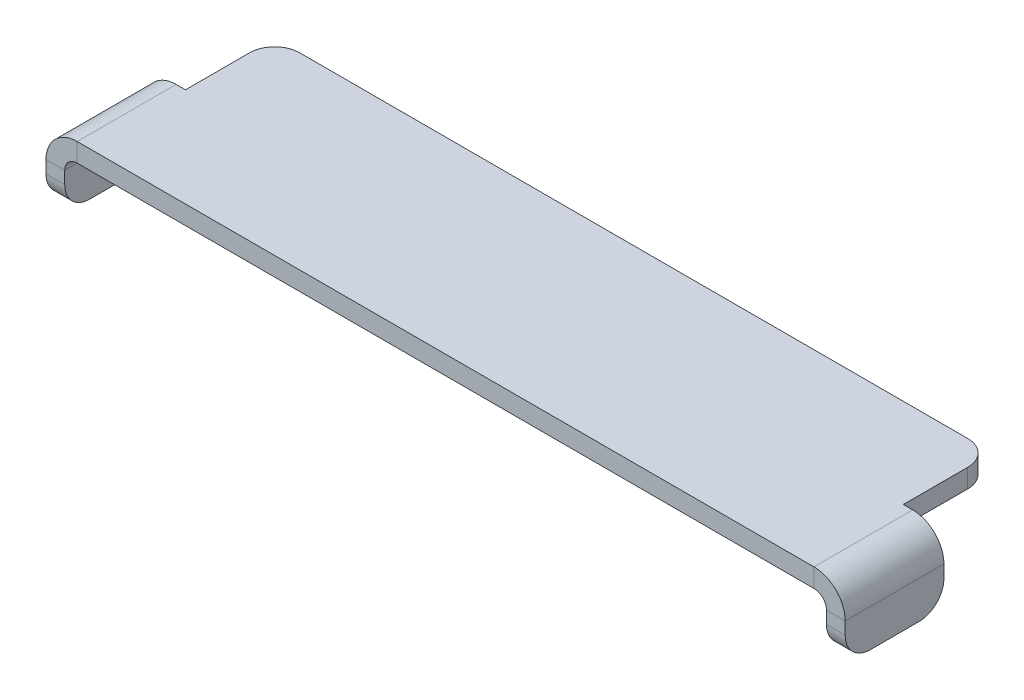
ISO-10303-21;
HEADER;
FILE_DESCRIPTION(('STEP AP214'),'2;1');
FILE_NAME('part.step','',(''),(''),'','','');
FILE_SCHEMA(('AUTOMOTIVE_DESIGN { 1 0 10303 214 1 1 1 1 }'));
ENDSEC;
DATA;
#1=APPLICATION_CONTEXT('core data for automotive mechanical design processes');
#2=APPLICATION_PROTOCOL_DEFINITION('international standard','automotive_design',2000,#1);
#3=PRODUCT_CONTEXT('',#1,'mechanical');
#4=PRODUCT('Part','Part','',(#3));
#5=PRODUCT_RELATED_PRODUCT_CATEGORY('part','',(#4));
#6=PRODUCT_DEFINITION_FORMATION('','',#4);
#7=PRODUCT_DEFINITION_CONTEXT('part definition',#1,'design');
#8=PRODUCT_DEFINITION('design','',#6,#7);
#9=PRODUCT_DEFINITION_SHAPE('','',#8);
#10=(LENGTH_UNIT() NAMED_UNIT(*) SI_UNIT(.MILLI.,.METRE.));
#11=(NAMED_UNIT(*) PLANE_ANGLE_UNIT() SI_UNIT($,.RADIAN.));
#12=(NAMED_UNIT(*) SI_UNIT($,.STERADIAN.) SOLID_ANGLE_UNIT());
#13=UNCERTAINTY_MEASURE_WITH_UNIT(LENGTH_MEASURE(1.E-05),#10,'distance_accuracy_value','');
#14=(GEOMETRIC_REPRESENTATION_CONTEXT(3) GLOBAL_UNCERTAINTY_ASSIGNED_CONTEXT((#13)) GLOBAL_UNIT_ASSIGNED_CONTEXT((#10,
#11,#12)) REPRESENTATION_CONTEXT('',''));
#15=CARTESIAN_POINT('',(0.,0.,0.));
#16=DIRECTION('',(0.,0.,1.));
#17=DIRECTION('',(1.,0.,0.));
#18=AXIS2_PLACEMENT_3D('',#15,#16,#17);
#19=CARTESIAN_POINT('',(0.,-1.5,0.));
#20=DIRECTION('',(0.,-1.,0.));
#21=DIRECTION('',(0.,0.,-1.));
#22=AXIS2_PLACEMENT_3D('',#19,#20,#21);
#23=PLANE('',#22);
#24=DIRECTION('',(0.,0.,1.));
#25=VECTOR('',#24,1.);
#26=CARTESIAN_POINT('',(3.25,-1.5,-8.67099203048986));
#27=LINE('',#26,#25);
#28=CARTESIAN_POINT('',(3.25,-1.5,-13.0604680029471));
#29=VERTEX_POINT('',#28);
#30=CARTESIAN_POINT('',(3.25,-1.5,-7.92099203048986));
#31=VERTEX_POINT('',#30);
#32=EDGE_CURVE('E340',#29,#31,#27,.T.);
#33=ORIENTED_EDGE('',*,*,#32,.F.);
#34=CARTESIAN_POINT('',(5.25,-1.5,-13.0604680029471));
#35=DIRECTION('',(0.,-1.,0.));
#36=DIRECTION('',(0.,0.,-1.));
#37=AXIS2_PLACEMENT_3D('',#34,#35,#36);
#38=CIRCLE('',#37,2.);
#39=CARTESIAN_POINT('',(5.25,-1.5,-15.0604680029471));
#40=VERTEX_POINT('',#39);
#41=EDGE_CURVE('E406',#29,#40,#38,.T.);
#42=ORIENTED_EDGE('',*,*,#41,.T.);
#43=DIRECTION('',(-1.,0.,0.));
#44=VECTOR('',#43,1.);
#45=CARTESIAN_POINT('',(0.,-1.5,-15.0604680029471));
#46=LINE('',#45,#44);
#47=CARTESIAN_POINT('',(58.75,-1.5,-15.0604680029471));
#48=VERTEX_POINT('',#47);
#49=EDGE_CURVE('E358',#48,#40,#46,.T.);
#50=ORIENTED_EDGE('',*,*,#49,.F.);
#51=CARTESIAN_POINT('',(58.75,-1.5,-13.0604680029471));
#52=DIRECTION('',(0.,-1.,0.));
#53=DIRECTION('',(0.,0.,-1.));
#54=AXIS2_PLACEMENT_3D('',#51,#52,#53);
#55=CIRCLE('',#54,2.);
#56=CARTESIAN_POINT('',(60.75,-1.5,-13.0604680029471));
#57=VERTEX_POINT('',#56);
#58=EDGE_CURVE('E404',#48,#57,#55,.T.);
#59=ORIENTED_EDGE('',*,*,#58,.T.);
#60=DIRECTION('',(0.,0.,-1.));
#61=VECTOR('',#60,1.);
#62=CARTESIAN_POINT('',(60.75,-1.5,-7.9044110420261));
#63=LINE('',#62,#61);
#64=CARTESIAN_POINT('',(60.75,-1.5,-7.9044110420261));
#65=VERTEX_POINT('',#64);
#66=EDGE_CURVE('E351',#65,#57,#63,.T.);
#67=ORIENTED_EDGE('',*,*,#66,.F.);
#68=DIRECTION('',(-1.,0.,0.));
#69=VECTOR('',#68,1.);
#70=CARTESIAN_POINT('',(61.5,-1.5,-7.9044110420261));
#71=LINE('',#70,#69);
#72=CARTESIAN_POINT('',(61.5,-1.5,-7.9044110420261));
#73=VERTEX_POINT('',#72);
#74=EDGE_CURVE('E347',#73,#65,#71,.T.);
#75=ORIENTED_EDGE('',*,*,#74,.F.);
#76=DIRECTION('',(0.,0.,1.));
#77=VECTOR('',#76,1.);
#78=CARTESIAN_POINT('',(61.5,-1.5,0.));
#79=LINE('',#78,#77);
#80=CARTESIAN_POINT('',(61.5,-1.5,0.));
#81=VERTEX_POINT('',#80);
#82=EDGE_CURVE('E330',#81,#73,#79,.F.);
#83=ORIENTED_EDGE('',*,*,#82,.F.);
#84=DIRECTION('',(1.,0.,0.));
#85=VECTOR('',#84,1.);
#86=CARTESIAN_POINT('',(0.,-1.5,0.));
#87=LINE('',#86,#85);
#88=CARTESIAN_POINT('',(2.5,-1.5,0.));
#89=VERTEX_POINT('',#88);
#90=EDGE_CURVE('E356',#89,#81,#87,.T.);
#91=ORIENTED_EDGE('',*,*,#90,.F.);
#92=DIRECTION('',(0.,0.,-1.));
#93=VECTOR('',#92,1.);
#94=CARTESIAN_POINT('',(2.5,-1.5,-7.92099203048986));
#95=LINE('',#94,#93);
#96=CARTESIAN_POINT('',(2.5,-1.5,-7.92099203048986));
#97=VERTEX_POINT('',#96);
#98=EDGE_CURVE('E285',#97,#89,#95,.F.);
#99=ORIENTED_EDGE('',*,*,#98,.F.);
#100=DIRECTION('',(-1.,0.,0.));
#101=VECTOR('',#100,1.);
#102=CARTESIAN_POINT('',(3.25,-1.5,-7.92099203048986));
#103=LINE('',#102,#101);
#104=EDGE_CURVE('E343',#31,#97,#103,.T.);
#105=ORIENTED_EDGE('',*,*,#104,.F.);
#106=EDGE_LOOP('',(#33,#42,#50,#59,#67,#75,#83,#91,#99,#105));
#107=FACE_BOUND('',#106,.T.);
#108=ADVANCED_FACE('F75',(#107),#23,.T.);
#109=CARTESIAN_POINT('',(0.,0.,0.));
#110=DIRECTION('',(0.,-1.,0.));
#111=DIRECTION('',(0.,0.,-1.));
#112=AXIS2_PLACEMENT_3D('',#109,#110,#111);
#113=PLANE('',#112);
#114=DIRECTION('',(-1.,0.,0.));
#115=VECTOR('',#114,1.);
#116=CARTESIAN_POINT('',(0.,0.,-15.0604680029471));
#117=LINE('',#116,#115);
#118=CARTESIAN_POINT('',(58.75,0.,-15.0604680029471));
#119=VERTEX_POINT('',#118);
#120=CARTESIAN_POINT('',(5.25,0.,-15.0604680029471));
#121=VERTEX_POINT('',#120);
#122=EDGE_CURVE('E359',#119,#121,#117,.T.);
#123=ORIENTED_EDGE('',*,*,#122,.T.);
#124=CARTESIAN_POINT('',(5.25,0.,-13.0604680029471));
#125=DIRECTION('',(0.,-1.,0.));
#126=DIRECTION('',(0.,0.,-1.));
#127=AXIS2_PLACEMENT_3D('',#124,#125,#126);
#128=CIRCLE('',#127,2.);
#129=CARTESIAN_POINT('',(3.25,0.,-13.0604680029471));
#130=VERTEX_POINT('',#129);
#131=EDGE_CURVE('E400',#121,#130,#128,.F.);
#132=ORIENTED_EDGE('',*,*,#131,.T.);
#133=DIRECTION('',(0.,0.,-1.));
#134=VECTOR('',#133,1.);
#135=CARTESIAN_POINT('',(3.25,0.,0.));
#136=LINE('',#135,#134);
#137=CARTESIAN_POINT('',(3.25,0.,-7.92099203048986));
#138=VERTEX_POINT('',#137);
#139=EDGE_CURVE('E373',#138,#130,#136,.T.);
#140=ORIENTED_EDGE('',*,*,#139,.F.);
#141=DIRECTION('',(1.,0.,0.));
#142=VECTOR('',#141,1.);
#143=CARTESIAN_POINT('',(0.,0.,-7.92099203048986));
#144=LINE('',#143,#142);
#145=CARTESIAN_POINT('',(2.5,0.,-7.92099203048986));
#146=VERTEX_POINT('',#145);
#147=EDGE_CURVE('E371',#146,#138,#144,.T.);
#148=ORIENTED_EDGE('',*,*,#147,.F.);
#149=DIRECTION('',(0.,0.,-1.));
#150=VECTOR('',#149,1.);
#151=CARTESIAN_POINT('',(2.5,0.,-7.92099203048986));
#152=LINE('',#151,#150);
#153=CARTESIAN_POINT('',(2.5,0.,0.));
#154=VERTEX_POINT('',#153);
#155=EDGE_CURVE('E234',#146,#154,#152,.F.);
#156=ORIENTED_EDGE('',*,*,#155,.T.);
#157=DIRECTION('',(1.,0.,0.));
#158=VECTOR('',#157,1.);
#159=CARTESIAN_POINT('',(0.,0.,0.));
#160=LINE('',#159,#158);
#161=CARTESIAN_POINT('',(61.5,0.,0.));
#162=VERTEX_POINT('',#161);
#163=EDGE_CURVE('E350',#154,#162,#160,.T.);
#164=ORIENTED_EDGE('',*,*,#163,.T.);
#165=DIRECTION('',(0.,0.,1.));
#166=VECTOR('',#165,1.);
#167=CARTESIAN_POINT('',(61.5,0.,0.));
#168=LINE('',#167,#166);
#169=CARTESIAN_POINT('',(61.5,0.,-7.9044110420261));
#170=VERTEX_POINT('',#169);
#171=EDGE_CURVE('E318',#162,#170,#168,.F.);
#172=ORIENTED_EDGE('',*,*,#171,.T.);
#173=DIRECTION('',(1.,0.,0.));
#174=VECTOR('',#173,1.);
#175=CARTESIAN_POINT('',(0.,0.,-7.9044110420261));
#176=LINE('',#175,#174);
#177=CARTESIAN_POINT('',(60.75,0.,-7.9044110420261));
#178=VERTEX_POINT('',#177);
#179=EDGE_CURVE('E368',#178,#170,#176,.T.);
#180=ORIENTED_EDGE('',*,*,#179,.F.);
#181=DIRECTION('',(0.,0.,1.));
#182=VECTOR('',#181,1.);
#183=CARTESIAN_POINT('',(60.75,0.,0.));
#184=LINE('',#183,#182);
#185=CARTESIAN_POINT('',(60.75,0.,-13.0604680029471));
#186=VERTEX_POINT('',#185);
#187=EDGE_CURVE('E362',#186,#178,#184,.T.);
#188=ORIENTED_EDGE('',*,*,#187,.F.);
#189=CARTESIAN_POINT('',(58.75,0.,-13.0604680029471));
#190=DIRECTION('',(0.,-1.,0.));
#191=DIRECTION('',(0.,0.,-1.));
#192=AXIS2_PLACEMENT_3D('',#189,#190,#191);
#193=CIRCLE('',#192,2.);
#194=EDGE_CURVE('E398',#186,#119,#193,.F.);
#195=ORIENTED_EDGE('',*,*,#194,.T.);
#196=EDGE_LOOP('',(#123,#132,#140,#148,#156,#164,#172,#180,#188,#195));
#197=FACE_BOUND('',#196,.T.);
#198=ADVANCED_FACE('F472',(#197),#113,.F.);
#199=CARTESIAN_POINT('',(0.,-1.5,0.));
#200=DIRECTION('',(0.,0.,1.));
#201=DIRECTION('',(1.,0.,0.));
#202=AXIS2_PLACEMENT_3D('',#199,#200,#201);
#203=PLANE('',#202);
#204=DIRECTION('',(0.,1.,0.));
#205=VECTOR('',#204,1.);
#206=CARTESIAN_POINT('',(2.5,-1.5,0.));
#207=LINE('',#206,#205);
#208=EDGE_CURVE('E289',#89,#154,#207,.T.);
#209=ORIENTED_EDGE('',*,*,#208,.F.);
#210=ORIENTED_EDGE('',*,*,#90,.T.);
#211=DIRECTION('',(0.,1.,0.));
#212=VECTOR('',#211,1.);
#213=CARTESIAN_POINT('',(61.5,-1.5,0.));
#214=LINE('',#213,#212);
#215=EDGE_CURVE('E324',#81,#162,#214,.T.);
#216=ORIENTED_EDGE('',*,*,#215,.T.);
#217=ORIENTED_EDGE('',*,*,#163,.F.);
#218=EDGE_LOOP('',(#209,#210,#216,#217));
#219=FACE_BOUND('',#218,.T.);
#220=ADVANCED_FACE('F470',(#219),#203,.T.);
#221=CARTESIAN_POINT('',(0.,-1.5,-15.0604680029471));
#222=DIRECTION('',(0.,0.,-1.));
#223=DIRECTION('',(-1.,0.,0.));
#224=AXIS2_PLACEMENT_3D('',#221,#222,#223);
#225=PLANE('',#224);
#226=ORIENTED_EDGE('',*,*,#49,.T.);
#227=DIRECTION('',(0.,1.,0.));
#228=VECTOR('',#227,1.);
#229=CARTESIAN_POINT('',(5.25,-1.5,-15.0604680029471));
#230=LINE('',#229,#228);
#231=EDGE_CURVE('E395',#40,#121,#230,.T.);
#232=ORIENTED_EDGE('',*,*,#231,.T.);
#233=ORIENTED_EDGE('',*,*,#122,.F.);
#234=DIRECTION('',(0.,1.,0.));
#235=VECTOR('',#234,1.);
#236=CARTESIAN_POINT('',(58.75,-1.5,-15.0604680029471));
#237=LINE('',#236,#235);
#238=EDGE_CURVE('E393',#119,#48,#237,.F.);
#239=ORIENTED_EDGE('',*,*,#238,.T.);
#240=EDGE_LOOP('',(#226,#232,#233,#239));
#241=FACE_BOUND('',#240,.T.);
#242=ADVANCED_FACE('F520',(#241),#225,.T.);
#243=CARTESIAN_POINT('',(61.5,-1.5,-7.9044110420261));
#244=DIRECTION('',(0.,0.,-1.));
#245=DIRECTION('',(0.,1.,0.));
#246=AXIS2_PLACEMENT_3D('',#243,#244,#245);
#247=PLANE('',#246);
#248=DIRECTION('',(0.,1.,0.));
#249=VECTOR('',#248,1.);
#250=CARTESIAN_POINT('',(60.75,-1.5,-7.9044110420261));
#251=LINE('',#250,#249);
#252=EDGE_CURVE('E342',#65,#178,#251,.T.);
#253=ORIENTED_EDGE('',*,*,#252,.T.);
#254=ORIENTED_EDGE('',*,*,#179,.T.);
#255=DIRECTION('',(0.,1.,0.));
#256=VECTOR('',#255,1.);
#257=CARTESIAN_POINT('',(61.5,-1.5,-7.9044110420261));
#258=LINE('',#257,#256);
#259=EDGE_CURVE('E335',#73,#170,#258,.T.);
#260=ORIENTED_EDGE('',*,*,#259,.F.);
#261=ORIENTED_EDGE('',*,*,#74,.T.);
#262=EDGE_LOOP('',(#253,#254,#260,#261));
#263=FACE_BOUND('',#262,.T.);
#264=ADVANCED_FACE('F459',(#263),#247,.T.);
#265=CARTESIAN_POINT('',(60.75,-1.5,-7.9044110420261));
#266=DIRECTION('',(1.,0.,0.));
#267=DIRECTION('',(0.,0.,-1.));
#268=AXIS2_PLACEMENT_3D('',#265,#266,#267);
#269=PLANE('',#268);
#270=ORIENTED_EDGE('',*,*,#66,.T.);
#271=DIRECTION('',(0.,1.,0.));
#272=VECTOR('',#271,1.);
#273=CARTESIAN_POINT('',(60.75,-1.5,-13.0604680029471));
#274=LINE('',#273,#272);
#275=EDGE_CURVE('E408',#57,#186,#274,.T.);
#276=ORIENTED_EDGE('',*,*,#275,.T.);
#277=ORIENTED_EDGE('',*,*,#187,.T.);
#278=ORIENTED_EDGE('',*,*,#252,.F.);
#279=EDGE_LOOP('',(#270,#276,#277,#278));
#280=FACE_BOUND('',#279,.T.);
#281=ADVANCED_FACE('F675',(#280),#269,.T.);
#282=CARTESIAN_POINT('',(3.25,-1.5,-8.67099203048986));
#283=DIRECTION('',(-1.,0.,0.));
#284=DIRECTION('',(0.,0.,1.));
#285=AXIS2_PLACEMENT_3D('',#282,#283,#284);
#286=PLANE('',#285);
#287=ORIENTED_EDGE('',*,*,#139,.T.);
#288=DIRECTION('',(0.,1.,0.));
#289=VECTOR('',#288,1.);
#290=CARTESIAN_POINT('',(3.25,-1.5,-13.0604680029471));
#291=LINE('',#290,#289);
#292=EDGE_CURVE('E402',#130,#29,#291,.F.);
#293=ORIENTED_EDGE('',*,*,#292,.T.);
#294=ORIENTED_EDGE('',*,*,#32,.T.);
#295=DIRECTION('',(0.,1.,0.));
#296=VECTOR('',#295,1.);
#297=CARTESIAN_POINT('',(3.25,-1.5,-7.92099203048986));
#298=LINE('',#297,#296);
#299=EDGE_CURVE('E338',#31,#138,#298,.T.);
#300=ORIENTED_EDGE('',*,*,#299,.T.);
#301=EDGE_LOOP('',(#287,#293,#294,#300));
#302=FACE_BOUND('',#301,.T.);
#303=ADVANCED_FACE('F671',(#302),#286,.T.);
#304=CARTESIAN_POINT('',(3.25,-1.5,-7.92099203048986));
#305=DIRECTION('',(0.,0.,-1.));
#306=DIRECTION('',(0.,1.,0.));
#307=AXIS2_PLACEMENT_3D('',#304,#305,#306);
#308=PLANE('',#307);
#309=DIRECTION('',(0.,1.,0.));
#310=VECTOR('',#309,1.);
#311=CARTESIAN_POINT('',(2.5,-1.5,-7.92099203048986));
#312=LINE('',#311,#310);
#313=EDGE_CURVE('E281',#97,#146,#312,.T.);
#314=ORIENTED_EDGE('',*,*,#313,.T.);
#315=ORIENTED_EDGE('',*,*,#147,.T.);
#316=ORIENTED_EDGE('',*,*,#299,.F.);
#317=ORIENTED_EDGE('',*,*,#104,.T.);
#318=EDGE_LOOP('',(#314,#315,#316,#317));
#319=FACE_BOUND('',#318,.T.);
#320=ADVANCED_FACE('F476',(#319),#308,.T.);
#321=CARTESIAN_POINT('',(61.5,-2.50000000000001,-7.9044110420261));
#322=DIRECTION('',(0.,0.,-1.));
#323=DIRECTION('',(-1.,0.,0.));
#324=AXIS2_PLACEMENT_3D('',#321,#322,#323);
#325=PLANE('',#324);
#326=DIRECTION('',(-1.,0.,0.));
#327=VECTOR('',#326,1.);
#328=CARTESIAN_POINT('',(64.,-2.5,-7.9044110420261));
#329=LINE('',#328,#327);
#330=CARTESIAN_POINT('',(62.5,-2.5,-7.9044110420261));
#331=VERTEX_POINT('',#330);
#332=CARTESIAN_POINT('',(64.,-2.5,-7.9044110420261));
#333=VERTEX_POINT('',#332);
#334=EDGE_CURVE('E292',#331,#333,#329,.F.);
#335=ORIENTED_EDGE('',*,*,#334,.F.);
#336=CARTESIAN_POINT('',(61.5,-2.50000000000001,-7.9044110420261));
#337=DIRECTION('',(0.,0.,1.));
#338=DIRECTION('',(1.,0.,0.));
#339=AXIS2_PLACEMENT_3D('',#336,#337,#338);
#340=CIRCLE('',#339,1.);
#341=EDGE_CURVE('E327',#73,#331,#340,.F.);
#342=ORIENTED_EDGE('',*,*,#341,.F.);
#343=ORIENTED_EDGE('',*,*,#259,.T.);
#344=CARTESIAN_POINT('',(61.5,-2.50000000000001,-7.9044110420261));
#345=DIRECTION('',(0.,0.,1.));
#346=DIRECTION('',(1.,0.,0.));
#347=AXIS2_PLACEMENT_3D('',#344,#345,#346);
#348=CIRCLE('',#347,2.5);
#349=EDGE_CURVE('E320',#170,#333,#348,.F.);
#350=ORIENTED_EDGE('',*,*,#349,.T.);
#351=EDGE_LOOP('',(#335,#342,#343,#350));
#352=FACE_BOUND('',#351,.T.);
#353=ADVANCED_FACE('F455',(#352),#325,.T.);
#354=CARTESIAN_POINT('',(61.5,-2.50000000000001,0.));
#355=DIRECTION('',(0.,0.,-1.));
#356=DIRECTION('',(-1.,0.,0.));
#357=AXIS2_PLACEMENT_3D('',#354,#355,#356);
#358=PLANE('',#357);
#359=CARTESIAN_POINT('',(61.5,-2.50000000000001,0.));
#360=DIRECTION('',(0.,0.,1.));
#361=DIRECTION('',(1.,0.,0.));
#362=AXIS2_PLACEMENT_3D('',#359,#360,#361);
#363=CIRCLE('',#362,1.);
#364=CARTESIAN_POINT('',(62.5,-2.5,0.));
#365=VERTEX_POINT('',#364);
#366=EDGE_CURVE('E297',#365,#81,#363,.T.);
#367=ORIENTED_EDGE('',*,*,#366,.F.);
#368=DIRECTION('',(-1.,0.,0.));
#369=VECTOR('',#368,1.);
#370=CARTESIAN_POINT('',(62.5,-2.5,0.));
#371=LINE('',#370,#369);
#372=CARTESIAN_POINT('',(64.,-2.5,0.));
#373=VERTEX_POINT('',#372);
#374=EDGE_CURVE('E311',#365,#373,#371,.F.);
#375=ORIENTED_EDGE('',*,*,#374,.T.);
#376=CARTESIAN_POINT('',(61.5,-2.50000000000001,0.));
#377=DIRECTION('',(0.,0.,1.));
#378=DIRECTION('',(1.,0.,0.));
#379=AXIS2_PLACEMENT_3D('',#376,#377,#378);
#380=CIRCLE('',#379,2.5);
#381=EDGE_CURVE('E321',#373,#162,#380,.T.);
#382=ORIENTED_EDGE('',*,*,#381,.T.);
#383=ORIENTED_EDGE('',*,*,#215,.F.);
#384=EDGE_LOOP('',(#367,#375,#382,#383));
#385=FACE_BOUND('',#384,.T.);
#386=ADVANCED_FACE('F448',(#385),#358,.F.);
#387=CARTESIAN_POINT('',(61.5,-2.50000000000001,0.));
#388=DIRECTION('',(0.,0.,1.));
#389=DIRECTION('',(1.,0.,0.));
#390=AXIS2_PLACEMENT_3D('',#387,#388,#389);
#391=CYLINDRICAL_SURFACE('',#390,2.5);
#392=ORIENTED_EDGE('',*,*,#171,.F.);
#393=ORIENTED_EDGE('',*,*,#381,.F.);
#394=DIRECTION('',(0.,0.,1.));
#395=VECTOR('',#394,1.);
#396=CARTESIAN_POINT('',(64.,-2.5,-7.9044110420261));
#397=LINE('',#396,#395);
#398=EDGE_CURVE('E308',#373,#333,#397,.F.);
#399=ORIENTED_EDGE('',*,*,#398,.T.);
#400=ORIENTED_EDGE('',*,*,#349,.F.);
#401=EDGE_LOOP('',(#392,#393,#399,#400));
#402=FACE_BOUND('',#401,.T.);
#403=ADVANCED_FACE('F453',(#402),#391,.T.);
#404=CARTESIAN_POINT('',(61.5,-2.50000000000001,0.));
#405=DIRECTION('',(0.,0.,1.));
#406=DIRECTION('',(1.,0.,0.));
#407=AXIS2_PLACEMENT_3D('',#404,#405,#406);
#408=CYLINDRICAL_SURFACE('',#407,1.);
#409=ORIENTED_EDGE('',*,*,#82,.T.);
#410=ORIENTED_EDGE('',*,*,#341,.T.);
#411=DIRECTION('',(0.,0.,1.));
#412=VECTOR('',#411,1.);
#413=CARTESIAN_POINT('',(62.5,-2.5,-7.9044110420261));
#414=LINE('',#413,#412);
#415=EDGE_CURVE('E314',#331,#365,#414,.T.);
#416=ORIENTED_EDGE('',*,*,#415,.T.);
#417=ORIENTED_EDGE('',*,*,#366,.T.);
#418=EDGE_LOOP('',(#409,#410,#416,#417));
#419=FACE_BOUND('',#418,.T.);
#420=ADVANCED_FACE('F463',(#419),#408,.F.);
#421=CARTESIAN_POINT('',(64.,-5.49999999999999,0.));
#422=DIRECTION('',(0.,0.,-1.));
#423=DIRECTION('',(0.,1.,0.));
#424=AXIS2_PLACEMENT_3D('',#421,#422,#423);
#425=PLANE('',#424);
#426=DIRECTION('',(0.,1.,0.));
#427=VECTOR('',#426,1.);
#428=CARTESIAN_POINT('',(62.5,-5.5,0.));
#429=LINE('',#428,#427);
#430=CARTESIAN_POINT('',(62.5,-3.5,0.));
#431=VERTEX_POINT('',#430);
#432=EDGE_CURVE('E306',#365,#431,#429,.F.);
#433=ORIENTED_EDGE('',*,*,#432,.T.);
#434=DIRECTION('',(-1.,0.,0.));
#435=VECTOR('',#434,1.);
#436=CARTESIAN_POINT('',(64.,-3.5,0.));
#437=LINE('',#436,#435);
#438=CARTESIAN_POINT('',(64.,-3.5,0.));
#439=VERTEX_POINT('',#438);
#440=EDGE_CURVE('E13',#431,#439,#437,.F.);
#441=ORIENTED_EDGE('',*,*,#440,.T.);
#442=DIRECTION('',(0.,-1.,0.));
#443=VECTOR('',#442,1.);
#444=CARTESIAN_POINT('',(64.,2.27281826933296E-13,0.));
#445=LINE('',#444,#443);
#446=EDGE_CURVE('E300',#373,#439,#445,.T.);
#447=ORIENTED_EDGE('',*,*,#446,.F.);
#448=ORIENTED_EDGE('',*,*,#374,.F.);
#449=EDGE_LOOP('',(#433,#441,#447,#448));
#450=FACE_BOUND('',#449,.T.);
#451=ADVANCED_FACE('F445',(#450),#425,.F.);
#452=CARTESIAN_POINT('',(64.,-1.49999999999999,-7.9044110420261));
#453=DIRECTION('',(0.,0.,1.));
#454=DIRECTION('',(1.,0.,0.));
#455=AXIS2_PLACEMENT_3D('',#452,#453,#454);
#456=PLANE('',#455);
#457=DIRECTION('',(0.,1.,0.));
#458=VECTOR('',#457,1.);
#459=CARTESIAN_POINT('',(64.,2.27281826933296E-13,-7.9044110420261));
#460=LINE('',#459,#458);
#461=CARTESIAN_POINT('',(64.,-3.49999999999999,-7.9044110420261));
#462=VERTEX_POINT('',#461);
#463=EDGE_CURVE('E295',#462,#333,#460,.T.);
#464=ORIENTED_EDGE('',*,*,#463,.F.);
#465=DIRECTION('',(-1.,0.,0.));
#466=VECTOR('',#465,1.);
#467=CARTESIAN_POINT('',(64.,-3.49999999999999,-7.9044110420261));
#468=LINE('',#467,#466);
#469=CARTESIAN_POINT('',(62.5,-3.5,-7.9044110420261));
#470=VERTEX_POINT('',#469);
#471=EDGE_CURVE('E411',#462,#470,#468,.T.);
#472=ORIENTED_EDGE('',*,*,#471,.T.);
#473=DIRECTION('',(0.,-1.,0.));
#474=VECTOR('',#473,1.);
#475=CARTESIAN_POINT('',(62.5,-1.5,-7.9044110420261));
#476=LINE('',#475,#474);
#477=EDGE_CURVE('E302',#470,#331,#476,.F.);
#478=ORIENTED_EDGE('',*,*,#477,.T.);
#479=ORIENTED_EDGE('',*,*,#334,.T.);
#480=EDGE_LOOP('',(#464,#472,#478,#479));
#481=FACE_BOUND('',#480,.T.);
#482=ADVANCED_FACE('F431',(#481),#456,.F.);
#483=CARTESIAN_POINT('',(64.,2.27281826933296E-13,0.));
#484=DIRECTION('',(-1.,0.,0.));
#485=DIRECTION('',(0.,-1.,0.));
#486=AXIS2_PLACEMENT_3D('',#483,#484,#485);
#487=PLANE('',#486);
#488=DIRECTION('',(0.,0.,-1.));
#489=VECTOR('',#488,1.);
#490=CARTESIAN_POINT('',(64.,-5.49999999999999,0.));
#491=LINE('',#490,#489);
#492=CARTESIAN_POINT('',(64.,-5.49999999999999,-2.));
#493=VERTEX_POINT('',#492);
#494=CARTESIAN_POINT('',(64.,-5.49999999999999,-5.9044110420261));
#495=VERTEX_POINT('',#494);
#496=EDGE_CURVE('E298',#493,#495,#491,.T.);
#497=ORIENTED_EDGE('',*,*,#496,.T.);
#498=CARTESIAN_POINT('',(64.,-3.49999999999999,-5.9044110420261));
#499=DIRECTION('',(-1.,0.,0.));
#500=DIRECTION('',(0.,-1.,0.));
#501=AXIS2_PLACEMENT_3D('',#498,#499,#500);
#502=CIRCLE('',#501,2.);
#503=EDGE_CURVE('E83',#495,#462,#502,.F.);
#504=ORIENTED_EDGE('',*,*,#503,.T.);
#505=ORIENTED_EDGE('',*,*,#463,.T.);
#506=ORIENTED_EDGE('',*,*,#398,.F.);
#507=ORIENTED_EDGE('',*,*,#446,.T.);
#508=CARTESIAN_POINT('',(64.,-3.49999999999999,-2.));
#509=DIRECTION('',(-1.,0.,0.));
#510=DIRECTION('',(0.,-1.,0.));
#511=AXIS2_PLACEMENT_3D('',#508,#509,#510);
#512=CIRCLE('',#511,2.);
#513=EDGE_CURVE('E422',#439,#493,#512,.F.);
#514=ORIENTED_EDGE('',*,*,#513,.T.);
#515=EDGE_LOOP('',(#497,#504,#505,#506,#507,#514));
#516=FACE_BOUND('',#515,.T.);
#517=ADVANCED_FACE('F426',(#516),#487,.F.);
#518=CARTESIAN_POINT('',(62.5,2.22044604925031E-13,0.));
#519=DIRECTION('',(-1.,0.,0.));
#520=DIRECTION('',(0.,-1.,0.));
#521=AXIS2_PLACEMENT_3D('',#518,#519,#520);
#522=PLANE('',#521);
#523=ORIENTED_EDGE('',*,*,#477,.F.);
#524=CARTESIAN_POINT('',(62.5,-3.5,-5.9044110420261));
#525=DIRECTION('',(-1.,0.,0.));
#526=DIRECTION('',(0.,-1.,0.));
#527=AXIS2_PLACEMENT_3D('',#524,#525,#526);
#528=CIRCLE('',#527,2.);
#529=CARTESIAN_POINT('',(62.5,-5.5,-5.9044110420261));
#530=VERTEX_POINT('',#529);
#531=EDGE_CURVE('E416',#470,#530,#528,.T.);
#532=ORIENTED_EDGE('',*,*,#531,.T.);
#533=DIRECTION('',(0.,0.,1.));
#534=VECTOR('',#533,1.);
#535=CARTESIAN_POINT('',(62.5,-5.5,-7.9044110420261));
#536=LINE('',#535,#534);
#537=CARTESIAN_POINT('',(62.5,-5.5,-2.));
#538=VERTEX_POINT('',#537);
#539=EDGE_CURVE('E304',#538,#530,#536,.F.);
#540=ORIENTED_EDGE('',*,*,#539,.F.);
#541=CARTESIAN_POINT('',(62.5,-3.5,-2.));
#542=DIRECTION('',(-1.,0.,0.));
#543=DIRECTION('',(0.,-1.,0.));
#544=AXIS2_PLACEMENT_3D('',#541,#542,#543);
#545=CIRCLE('',#544,2.);
#546=EDGE_CURVE('E414',#538,#431,#545,.T.);
#547=ORIENTED_EDGE('',*,*,#546,.T.);
#548=ORIENTED_EDGE('',*,*,#432,.F.);
#549=ORIENTED_EDGE('',*,*,#415,.F.);
#550=EDGE_LOOP('',(#523,#532,#540,#547,#548,#549));
#551=FACE_BOUND('',#550,.T.);
#552=ADVANCED_FACE('F437',(#551),#522,.T.);
#553=CARTESIAN_POINT('',(64.,-5.49999999999999,-7.9044110420261));
#554=DIRECTION('',(0.,1.,0.));
#555=DIRECTION('',(-1.,0.,0.));
#556=AXIS2_PLACEMENT_3D('',#553,#554,#555);
#557=PLANE('',#556);
#558=ORIENTED_EDGE('',*,*,#539,.T.);
#559=DIRECTION('',(-1.,0.,0.));
#560=VECTOR('',#559,1.);
#561=CARTESIAN_POINT('',(64.,-5.49999999999999,-5.9044110420261));
#562=LINE('',#561,#560);
#563=EDGE_CURVE('E96',#530,#495,#562,.F.);
#564=ORIENTED_EDGE('',*,*,#563,.T.);
#565=ORIENTED_EDGE('',*,*,#496,.F.);
#566=DIRECTION('',(-1.,0.,0.));
#567=VECTOR('',#566,1.);
#568=CARTESIAN_POINT('',(64.,-5.49999999999999,-2.));
#569=LINE('',#568,#567);
#570=EDGE_CURVE('E418',#493,#538,#569,.T.);
#571=ORIENTED_EDGE('',*,*,#570,.T.);
#572=EDGE_LOOP('',(#558,#564,#565,#571));
#573=FACE_BOUND('',#572,.T.);
#574=ADVANCED_FACE('F439',(#573),#557,.F.);
#575=CARTESIAN_POINT('',(2.5,-2.5,0.));
#576=DIRECTION('',(0.,0.,1.));
#577=DIRECTION('',(1.,0.,0.));
#578=AXIS2_PLACEMENT_3D('',#575,#576,#577);
#579=PLANE('',#578);
#580=DIRECTION('',(1.,0.,0.));
#581=VECTOR('',#580,1.);
#582=CARTESIAN_POINT('',(0.,-2.49999999999999,0.));
#583=LINE('',#582,#581);
#584=CARTESIAN_POINT('',(1.5,-2.5,0.));
#585=VERTEX_POINT('',#584);
#586=CARTESIAN_POINT('',(0.,-2.49999999999999,0.));
#587=VERTEX_POINT('',#586);
#588=EDGE_CURVE('E276',#585,#587,#583,.F.);
#589=ORIENTED_EDGE('',*,*,#588,.F.);
#590=CARTESIAN_POINT('',(2.5,-2.5,0.));
#591=DIRECTION('',(0.,0.,-1.));
#592=DIRECTION('',(-1.,0.,0.));
#593=AXIS2_PLACEMENT_3D('',#590,#591,#592);
#594=CIRCLE('',#593,1.);
#595=EDGE_CURVE('E237',#89,#585,#594,.F.);
#596=ORIENTED_EDGE('',*,*,#595,.F.);
#597=ORIENTED_EDGE('',*,*,#208,.T.);
#598=CARTESIAN_POINT('',(2.5,-2.5,0.));
#599=DIRECTION('',(0.,0.,-1.));
#600=DIRECTION('',(-1.,0.,0.));
#601=AXIS2_PLACEMENT_3D('',#598,#599,#600);
#602=CIRCLE('',#601,2.5);
#603=EDGE_CURVE('E280',#154,#587,#602,.F.);
#604=ORIENTED_EDGE('',*,*,#603,.T.);
#605=EDGE_LOOP('',(#589,#596,#597,#604));
#606=FACE_BOUND('',#605,.T.);
#607=ADVANCED_FACE('F501',(#606),#579,.T.);
#608=CARTESIAN_POINT('',(2.5,-2.5,-7.92099203048986));
#609=DIRECTION('',(0.,0.,1.));
#610=DIRECTION('',(1.,0.,0.));
#611=AXIS2_PLACEMENT_3D('',#608,#609,#610);
#612=PLANE('',#611);
#613=CARTESIAN_POINT('',(2.5,-2.5,-7.92099203048986));
#614=DIRECTION('',(0.,0.,-1.));
#615=DIRECTION('',(-1.,0.,0.));
#616=AXIS2_PLACEMENT_3D('',#613,#614,#615);
#617=CIRCLE('',#616,1.);
#618=CARTESIAN_POINT('',(1.5,-2.5,-7.92099203048986));
#619=VERTEX_POINT('',#618);
#620=EDGE_CURVE('E244',#619,#97,#617,.T.);
#621=ORIENTED_EDGE('',*,*,#620,.F.);
#622=DIRECTION('',(1.,0.,0.));
#623=VECTOR('',#622,1.);
#624=CARTESIAN_POINT('',(1.5,-2.5,-7.92099203048986));
#625=LINE('',#624,#623);
#626=CARTESIAN_POINT('',(0.,-2.49999999999999,-7.92099203048986));
#627=VERTEX_POINT('',#626);
#628=EDGE_CURVE('E241',#619,#627,#625,.F.);
#629=ORIENTED_EDGE('',*,*,#628,.T.);
#630=CARTESIAN_POINT('',(2.5,-2.5,-7.92099203048986));
#631=DIRECTION('',(0.,0.,-1.));
#632=DIRECTION('',(-1.,0.,0.));
#633=AXIS2_PLACEMENT_3D('',#630,#631,#632);
#634=CIRCLE('',#633,2.5);
#635=EDGE_CURVE('E227',#627,#146,#634,.T.);
#636=ORIENTED_EDGE('',*,*,#635,.T.);
#637=ORIENTED_EDGE('',*,*,#313,.F.);
#638=EDGE_LOOP('',(#621,#629,#636,#637));
#639=FACE_BOUND('',#638,.T.);
#640=ADVANCED_FACE('F242',(#639),#612,.F.);
#641=CARTESIAN_POINT('',(2.5,-2.5,-7.92099203048986));
#642=DIRECTION('',(0.,0.,-1.));
#643=DIRECTION('',(-1.,0.,0.));
#644=AXIS2_PLACEMENT_3D('',#641,#642,#643);
#645=CYLINDRICAL_SURFACE('',#644,2.5);
#646=ORIENTED_EDGE('',*,*,#155,.F.);
#647=ORIENTED_EDGE('',*,*,#635,.F.);
#648=DIRECTION('',(0.,0.,-1.));
#649=VECTOR('',#648,1.);
#650=CARTESIAN_POINT('',(0.,-2.49999999999999,0.));
#651=LINE('',#650,#649);
#652=EDGE_CURVE('E232',#627,#587,#651,.F.);
#653=ORIENTED_EDGE('',*,*,#652,.T.);
#654=ORIENTED_EDGE('',*,*,#603,.F.);
#655=EDGE_LOOP('',(#646,#647,#653,#654));
#656=FACE_BOUND('',#655,.T.);
#657=ADVANCED_FACE('F229',(#656),#645,.T.);
#658=CARTESIAN_POINT('',(2.5,-2.5,-7.92099203048986));
#659=DIRECTION('',(0.,0.,-1.));
#660=DIRECTION('',(-1.,0.,0.));
#661=AXIS2_PLACEMENT_3D('',#658,#659,#660);
#662=CYLINDRICAL_SURFACE('',#661,1.);
#663=ORIENTED_EDGE('',*,*,#98,.T.);
#664=ORIENTED_EDGE('',*,*,#595,.T.);
#665=DIRECTION('',(0.,0.,-1.));
#666=VECTOR('',#665,1.);
#667=CARTESIAN_POINT('',(1.5,-2.5,0.));
#668=LINE('',#667,#666);
#669=EDGE_CURVE('E249',#585,#619,#668,.T.);
#670=ORIENTED_EDGE('',*,*,#669,.T.);
#671=ORIENTED_EDGE('',*,*,#620,.T.);
#672=EDGE_LOOP('',(#663,#664,#670,#671));
#673=FACE_BOUND('',#672,.T.);
#674=ADVANCED_FACE('F479',(#673),#662,.F.);
#675=CARTESIAN_POINT('',(0.,-5.49999999999999,-7.92099203048986));
#676=DIRECTION('',(0.,0.,1.));
#677=DIRECTION('',(1.,0.,0.));
#678=AXIS2_PLACEMENT_3D('',#675,#676,#677);
#679=PLANE('',#678);
#680=DIRECTION('',(0.,1.,0.));
#681=VECTOR('',#680,1.);
#682=CARTESIAN_POINT('',(1.49999999999999,-5.5,-7.92099203048986));
#683=LINE('',#682,#681);
#684=CARTESIAN_POINT('',(1.49999999999999,-3.5,-7.92099203048986));
#685=VERTEX_POINT('',#684);
#686=EDGE_CURVE('E259',#619,#685,#683,.F.);
#687=ORIENTED_EDGE('',*,*,#686,.T.);
#688=DIRECTION('',(1.,0.,0.));
#689=VECTOR('',#688,1.);
#690=CARTESIAN_POINT('',(0.,-3.49999999999999,-7.92099203048986));
#691=LINE('',#690,#689);
#692=CARTESIAN_POINT('',(0.,-3.49999999999999,-7.92099203048986));
#693=VERTEX_POINT('',#692);
#694=EDGE_CURVE('E263',#685,#693,#691,.F.);
#695=ORIENTED_EDGE('',*,*,#694,.T.);
#696=DIRECTION('',(0.,-1.,0.));
#697=VECTOR('',#696,1.);
#698=CARTESIAN_POINT('',(0.,0.,-7.92099203048986));
#699=LINE('',#698,#697);
#700=EDGE_CURVE('E255',#627,#693,#699,.T.);
#701=ORIENTED_EDGE('',*,*,#700,.F.);
#702=ORIENTED_EDGE('',*,*,#628,.F.);
#703=EDGE_LOOP('',(#687,#695,#701,#702));
#704=FACE_BOUND('',#703,.T.);
#705=ADVANCED_FACE('F261',(#704),#679,.F.);
#706=CARTESIAN_POINT('',(0.,-1.49999999999999,0.));
#707=DIRECTION('',(0.,0.,-1.));
#708=DIRECTION('',(-1.,0.,0.));
#709=AXIS2_PLACEMENT_3D('',#706,#707,#708);
#710=PLANE('',#709);
#711=DIRECTION('',(0.,1.,0.));
#712=VECTOR('',#711,1.);
#713=CARTESIAN_POINT('',(0.,0.,0.));
#714=LINE('',#713,#712);
#715=CARTESIAN_POINT('',(0.,-3.49999999999999,0.));
#716=VERTEX_POINT('',#715);
#717=EDGE_CURVE('E258',#716,#587,#714,.T.);
#718=ORIENTED_EDGE('',*,*,#717,.F.);
#719=DIRECTION('',(1.,0.,0.));
#720=VECTOR('',#719,1.);
#721=CARTESIAN_POINT('',(0.,-3.49999999999999,0.));
#722=LINE('',#721,#720);
#723=CARTESIAN_POINT('',(1.49999999999999,-3.5,0.));
#724=VERTEX_POINT('',#723);
#725=EDGE_CURVE('E376',#716,#724,#722,.T.);
#726=ORIENTED_EDGE('',*,*,#725,.T.);
#727=DIRECTION('',(0.,-1.,0.));
#728=VECTOR('',#727,1.);
#729=CARTESIAN_POINT('',(1.5,-1.5,0.));
#730=LINE('',#729,#728);
#731=EDGE_CURVE('E265',#724,#585,#730,.F.);
#732=ORIENTED_EDGE('',*,*,#731,.T.);
#733=ORIENTED_EDGE('',*,*,#588,.T.);
#734=EDGE_LOOP('',(#718,#726,#732,#733));
#735=FACE_BOUND('',#734,.T.);
#736=ADVANCED_FACE('F498',(#735),#710,.F.);
#737=CARTESIAN_POINT('',(0.,0.,0.));
#738=DIRECTION('',(1.,0.,0.));
#739=DIRECTION('',(0.,1.,0.));
#740=AXIS2_PLACEMENT_3D('',#737,#738,#739);
#741=PLANE('',#740);
#742=DIRECTION('',(0.,0.,1.));
#743=VECTOR('',#742,1.);
#744=CARTESIAN_POINT('',(0.,-5.49999999999999,0.));
#745=LINE('',#744,#743);
#746=CARTESIAN_POINT('',(0.,-5.49999999999999,-5.92099203048986));
#747=VERTEX_POINT('',#746);
#748=CARTESIAN_POINT('',(0.,-5.49999999999999,-2.));
#749=VERTEX_POINT('',#748);
#750=EDGE_CURVE('E264',#747,#749,#745,.T.);
#751=ORIENTED_EDGE('',*,*,#750,.T.);
#752=CARTESIAN_POINT('',(0.,-3.49999999999999,-2.));
#753=DIRECTION('',(1.,0.,0.));
#754=DIRECTION('',(0.,1.,0.));
#755=AXIS2_PLACEMENT_3D('',#752,#753,#754);
#756=CIRCLE('',#755,2.);
#757=EDGE_CURVE('E390',#749,#716,#756,.F.);
#758=ORIENTED_EDGE('',*,*,#757,.T.);
#759=ORIENTED_EDGE('',*,*,#717,.T.);
#760=ORIENTED_EDGE('',*,*,#652,.F.);
#761=ORIENTED_EDGE('',*,*,#700,.T.);
#762=CARTESIAN_POINT('',(0.,-3.49999999999999,-5.92099203048986));
#763=DIRECTION('',(1.,0.,0.));
#764=DIRECTION('',(0.,1.,0.));
#765=AXIS2_PLACEMENT_3D('',#762,#763,#764);
#766=CIRCLE('',#765,2.);
#767=EDGE_CURVE('E388',#693,#747,#766,.F.);
#768=ORIENTED_EDGE('',*,*,#767,.T.);
#769=EDGE_LOOP('',(#751,#758,#759,#760,#761,#768));
#770=FACE_BOUND('',#769,.T.);
#771=ADVANCED_FACE('F254',(#770),#741,.F.);
#772=CARTESIAN_POINT('',(1.50000000000001,0.,0.));
#773=DIRECTION('',(1.,0.,0.));
#774=DIRECTION('',(0.,1.,0.));
#775=AXIS2_PLACEMENT_3D('',#772,#773,#774);
#776=PLANE('',#775);
#777=ORIENTED_EDGE('',*,*,#731,.F.);
#778=CARTESIAN_POINT('',(1.49999999999999,-3.5,-2.));
#779=DIRECTION('',(1.,0.,0.));
#780=DIRECTION('',(0.,1.,0.));
#781=AXIS2_PLACEMENT_3D('',#778,#779,#780);
#782=CIRCLE('',#781,2.);
#783=CARTESIAN_POINT('',(1.49999999999999,-5.5,-2.));
#784=VERTEX_POINT('',#783);
#785=EDGE_CURVE('E381',#724,#784,#782,.T.);
#786=ORIENTED_EDGE('',*,*,#785,.T.);
#787=DIRECTION('',(0.,0.,-1.));
#788=VECTOR('',#787,1.);
#789=CARTESIAN_POINT('',(1.49999999999999,-5.5,0.));
#790=LINE('',#789,#788);
#791=CARTESIAN_POINT('',(1.49999999999999,-5.5,-5.92099203048986));
#792=VERTEX_POINT('',#791);
#793=EDGE_CURVE('E268',#792,#784,#790,.F.);
#794=ORIENTED_EDGE('',*,*,#793,.F.);
#795=CARTESIAN_POINT('',(1.49999999999999,-3.5,-5.92099203048986));
#796=DIRECTION('',(1.,0.,0.));
#797=DIRECTION('',(0.,1.,0.));
#798=AXIS2_PLACEMENT_3D('',#795,#796,#797);
#799=CIRCLE('',#798,2.);
#800=EDGE_CURVE('E379',#792,#685,#799,.T.);
#801=ORIENTED_EDGE('',*,*,#800,.T.);
#802=ORIENTED_EDGE('',*,*,#686,.F.);
#803=ORIENTED_EDGE('',*,*,#669,.F.);
#804=EDGE_LOOP('',(#777,#786,#794,#801,#802,#803));
#805=FACE_BOUND('',#804,.T.);
#806=ADVANCED_FACE('F484',(#805),#776,.T.);
#807=CARTESIAN_POINT('',(0.,-5.49999999999999,0.));
#808=DIRECTION('',(0.,1.,0.));
#809=DIRECTION('',(-1.,0.,0.));
#810=AXIS2_PLACEMENT_3D('',#807,#808,#809);
#811=PLANE('',#810);
#812=ORIENTED_EDGE('',*,*,#793,.T.);
#813=DIRECTION('',(1.,0.,0.));
#814=VECTOR('',#813,1.);
#815=CARTESIAN_POINT('',(0.,-5.49999999999999,-2.));
#816=LINE('',#815,#814);
#817=EDGE_CURVE('E386',#784,#749,#816,.F.);
#818=ORIENTED_EDGE('',*,*,#817,.T.);
#819=ORIENTED_EDGE('',*,*,#750,.F.);
#820=DIRECTION('',(1.,0.,0.));
#821=VECTOR('',#820,1.);
#822=CARTESIAN_POINT('',(0.,-5.49999999999999,-5.92099203048986));
#823=LINE('',#822,#821);
#824=EDGE_CURVE('E383',#747,#792,#823,.T.);
#825=ORIENTED_EDGE('',*,*,#824,.T.);
#826=EDGE_LOOP('',(#812,#818,#819,#825));
#827=FACE_BOUND('',#826,.T.);
#828=ADVANCED_FACE('F492',(#827),#811,.F.);
#829=CARTESIAN_POINT('',(0.,-3.49999999999999,-2.));
#830=DIRECTION('',(1.,0.,0.));
#831=DIRECTION('',(0.,1.,0.));
#832=AXIS2_PLACEMENT_3D('',#829,#830,#831);
#833=CYLINDRICAL_SURFACE('',#832,2.);
#834=ORIENTED_EDGE('',*,*,#757,.F.);
#835=ORIENTED_EDGE('',*,*,#817,.F.);
#836=ORIENTED_EDGE('',*,*,#785,.F.);
#837=ORIENTED_EDGE('',*,*,#725,.F.);
#838=EDGE_LOOP('',(#834,#835,#836,#837));
#839=FACE_BOUND('',#838,.T.);
#840=ADVANCED_FACE('F495',(#839),#833,.T.);
#841=CARTESIAN_POINT('',(0.,-3.49999999999999,-5.92099203048986));
#842=DIRECTION('',(1.,0.,0.));
#843=DIRECTION('',(0.,1.,0.));
#844=AXIS2_PLACEMENT_3D('',#841,#842,#843);
#845=CYLINDRICAL_SURFACE('',#844,2.);
#846=ORIENTED_EDGE('',*,*,#767,.F.);
#847=ORIENTED_EDGE('',*,*,#694,.F.);
#848=ORIENTED_EDGE('',*,*,#800,.F.);
#849=ORIENTED_EDGE('',*,*,#824,.F.);
#850=EDGE_LOOP('',(#846,#847,#848,#849));
#851=FACE_BOUND('',#850,.T.);
#852=ADVANCED_FACE('F487',(#851),#845,.T.);
#853=CARTESIAN_POINT('',(5.25,-1.5,-13.0604680029471));
#854=DIRECTION('',(0.,1.,0.));
#855=DIRECTION('',(0.,0.,1.));
#856=AXIS2_PLACEMENT_3D('',#853,#854,#855);
#857=CYLINDRICAL_SURFACE('',#856,2.);
#858=ORIENTED_EDGE('',*,*,#41,.F.);
#859=ORIENTED_EDGE('',*,*,#292,.F.);
#860=ORIENTED_EDGE('',*,*,#131,.F.);
#861=ORIENTED_EDGE('',*,*,#231,.F.);
#862=EDGE_LOOP('',(#858,#859,#860,#861));
#863=FACE_BOUND('',#862,.T.);
#864=ADVANCED_FACE('F530',(#863),#857,.T.);
#865=CARTESIAN_POINT('',(58.75,-1.5,-13.0604680029471));
#866=DIRECTION('',(0.,1.,0.));
#867=DIRECTION('',(0.,0.,1.));
#868=AXIS2_PLACEMENT_3D('',#865,#866,#867);
#869=CYLINDRICAL_SURFACE('',#868,2.);
#870=ORIENTED_EDGE('',*,*,#58,.F.);
#871=ORIENTED_EDGE('',*,*,#238,.F.);
#872=ORIENTED_EDGE('',*,*,#194,.F.);
#873=ORIENTED_EDGE('',*,*,#275,.F.);
#874=EDGE_LOOP('',(#870,#871,#872,#873));
#875=FACE_BOUND('',#874,.T.);
#876=ADVANCED_FACE('F533',(#875),#869,.T.);
#877=CARTESIAN_POINT('',(64.,-3.49999999999999,-5.9044110420261));
#878=DIRECTION('',(-1.,0.,0.));
#879=DIRECTION('',(0.,-1.,0.));
#880=AXIS2_PLACEMENT_3D('',#877,#878,#879);
#881=CYLINDRICAL_SURFACE('',#880,2.);
#882=ORIENTED_EDGE('',*,*,#503,.F.);
#883=ORIENTED_EDGE('',*,*,#563,.F.);
#884=ORIENTED_EDGE('',*,*,#531,.F.);
#885=ORIENTED_EDGE('',*,*,#471,.F.);
#886=EDGE_LOOP('',(#882,#883,#884,#885));
#887=FACE_BOUND('',#886,.T.);
#888=ADVANCED_FACE('F434',(#887),#881,.T.);
#889=CARTESIAN_POINT('',(64.,-3.49999999999999,-2.));
#890=DIRECTION('',(-1.,0.,0.));
#891=DIRECTION('',(0.,-1.,0.));
#892=AXIS2_PLACEMENT_3D('',#889,#890,#891);
#893=CYLINDRICAL_SURFACE('',#892,2.);
#894=ORIENTED_EDGE('',*,*,#513,.F.);
#895=ORIENTED_EDGE('',*,*,#440,.F.);
#896=ORIENTED_EDGE('',*,*,#546,.F.);
#897=ORIENTED_EDGE('',*,*,#570,.F.);
#898=EDGE_LOOP('',(#894,#895,#896,#897));
#899=FACE_BOUND('',#898,.T.);
#900=ADVANCED_FACE('F77',(#899),#893,.T.);
#901=CLOSED_SHELL('',(#108,#198,#220,#242,#264,#281,#303,#320,#353,#386,#403,#420,#451,#482,
#517,#552,#574,#607,#640,#657,#674,#705,#736,#771,#806,#828,#840,#852,#864,#876,#888,#900));
#902=MANIFOLD_SOLID_BREP('B2',#901);
#903=ADVANCED_BREP_SHAPE_REPRESENTATION('',(#18,#902),#14);
#904=SHAPE_DEFINITION_REPRESENTATION(#9,#903);
ENDSEC;
END-ISO-10303-21;
